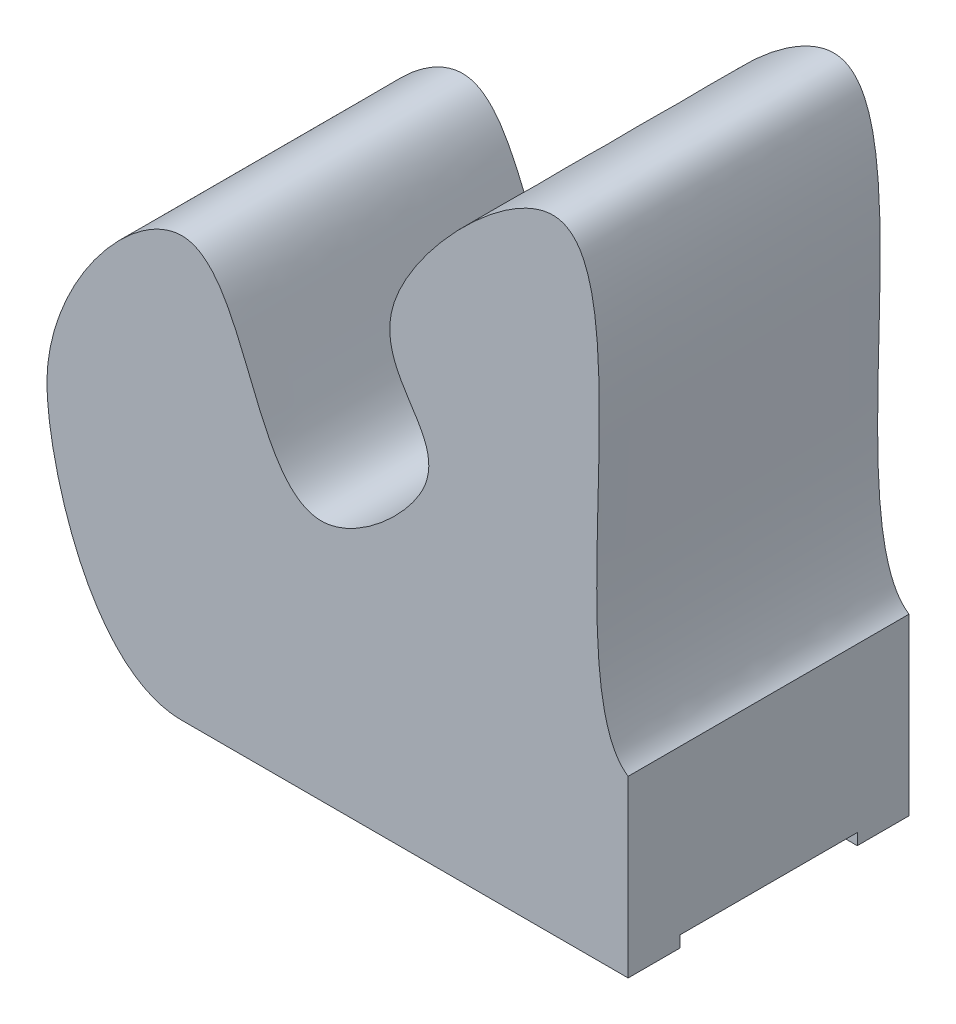
ISO-10303-21;
HEADER;
FILE_DESCRIPTION(('STEP AP214'),'2;1');
FILE_NAME('part.step','',(''),(''),'','','');
FILE_SCHEMA(('AUTOMOTIVE_DESIGN { 1 0 10303 214 1 1 1 1 }'));
ENDSEC;
DATA;
#1=APPLICATION_CONTEXT('core data for automotive mechanical design processes');
#2=APPLICATION_PROTOCOL_DEFINITION('international standard','automotive_design',2000,#1);
#3=PRODUCT_CONTEXT('',#1,'mechanical');
#4=PRODUCT('Part','Part','',(#3));
#5=PRODUCT_RELATED_PRODUCT_CATEGORY('part','',(#4));
#6=PRODUCT_DEFINITION_FORMATION('','',#4);
#7=PRODUCT_DEFINITION_CONTEXT('part definition',#1,'design');
#8=PRODUCT_DEFINITION('design','',#6,#7);
#9=PRODUCT_DEFINITION_SHAPE('','',#8);
#10=(LENGTH_UNIT() NAMED_UNIT(*) SI_UNIT(.MILLI.,.METRE.));
#11=(NAMED_UNIT(*) PLANE_ANGLE_UNIT() SI_UNIT($,.RADIAN.));
#12=(NAMED_UNIT(*) SI_UNIT($,.STERADIAN.) SOLID_ANGLE_UNIT());
#13=UNCERTAINTY_MEASURE_WITH_UNIT(LENGTH_MEASURE(1.E-05),#10,'distance_accuracy_value','');
#14=(GEOMETRIC_REPRESENTATION_CONTEXT(3) GLOBAL_UNCERTAINTY_ASSIGNED_CONTEXT((#13)) GLOBAL_UNIT_ASSIGNED_CONTEXT((#10,
#11,#12)) REPRESENTATION_CONTEXT('',''));
#15=CARTESIAN_POINT('',(0.,0.,0.));
#16=DIRECTION('',(0.,0.,1.));
#17=DIRECTION('',(1.,0.,0.));
#18=AXIS2_PLACEMENT_3D('',#15,#16,#17);
#19=CARTESIAN_POINT('',(0.,0.,5.9944));
#20=DIRECTION('',(0.,1.,0.));
#21=DIRECTION('',(0.,0.,1.));
#22=AXIS2_PLACEMENT_3D('',#19,#20,#21);
#23=PLANE('',#22);
#24=DIRECTION('',(-1.,0.,0.));
#25=VECTOR('',#24,1.);
#26=CARTESIAN_POINT('',(0.,0.,3.78540889222271));
#27=LINE('',#26,#25);
#28=CARTESIAN_POINT('',(19.05,0.,3.78540889222271));
#29=VERTEX_POINT('',#28);
#30=CARTESIAN_POINT('',(2.54,0.,3.78540889222271));
#31=VERTEX_POINT('',#30);
#32=EDGE_CURVE('E135',#29,#31,#27,.T.);
#33=ORIENTED_EDGE('',*,*,#32,.F.);
#34=DIRECTION('',(0.,0.,-1.));
#35=VECTOR('',#34,1.);
#36=CARTESIAN_POINT('',(19.05,0.,5.9944));
#37=LINE('',#36,#35);
#38=CARTESIAN_POINT('',(19.05,0.,5.9944));
#39=VERTEX_POINT('',#38);
#40=EDGE_CURVE('E126',#39,#29,#37,.T.);
#41=ORIENTED_EDGE('',*,*,#40,.F.);
#42=DIRECTION('',(1.,0.,0.));
#43=VECTOR('',#42,1.);
#44=CARTESIAN_POINT('',(0.,0.,5.9944));
#45=LINE('',#44,#43);
#46=CARTESIAN_POINT('',(0.,0.,5.9944));
#47=VERTEX_POINT('',#46);
#48=EDGE_CURVE('E144',#47,#39,#45,.T.);
#49=ORIENTED_EDGE('',*,*,#48,.F.);
#50=DIRECTION('',(0.,0.,-1.));
#51=VECTOR('',#50,1.);
#52=CARTESIAN_POINT('',(0.,0.,5.9944));
#53=LINE('',#52,#51);
#54=CARTESIAN_POINT('',(0.,0.,1.24540889222272));
#55=VERTEX_POINT('',#54);
#56=EDGE_CURVE('E194',#47,#55,#53,.T.);
#57=ORIENTED_EDGE('',*,*,#56,.T.);
#58=CARTESIAN_POINT('',(2.54,0.,1.24540889222271));
#59=DIRECTION('',(0.,1.,0.));
#60=DIRECTION('',(0.,0.,1.));
#61=AXIS2_PLACEMENT_3D('',#58,#59,#60);
#62=CIRCLE('',#61,2.54);
#63=EDGE_CURVE('E11',#55,#31,#62,.T.);
#64=ORIENTED_EDGE('',*,*,#63,.T.);
#65=EDGE_LOOP('',(#33,#41,#49,#57,#64));
#66=FACE_BOUND('',#65,.T.);
#67=ADVANCED_FACE('F35',(#66),#23,.F.);
#68=DIRECTION('',(1.,0.,0.));
#69=VECTOR('',#68,1.);
#70=CARTESIAN_POINT('',(0.,0.,-3.78540889222271));
#71=LINE('',#70,#69);
#72=CARTESIAN_POINT('',(2.54,0.,-3.78540889222271));
#73=VERTEX_POINT('',#72);
#74=CARTESIAN_POINT('',(19.05,0.,-3.78540889222271));
#75=VERTEX_POINT('',#74);
#76=EDGE_CURVE('E133',#73,#75,#71,.T.);
#77=ORIENTED_EDGE('',*,*,#76,.F.);
#78=CARTESIAN_POINT('',(2.54,0.,-1.24540889222271));
#79=DIRECTION('',(0.,1.,0.));
#80=DIRECTION('',(0.,0.,1.));
#81=AXIS2_PLACEMENT_3D('',#78,#79,#80);
#82=CIRCLE('',#81,2.54);
#83=CARTESIAN_POINT('',(0.,0.,-1.24540889222271));
#84=VERTEX_POINT('',#83);
#85=EDGE_CURVE('E44',#73,#84,#82,.T.);
#86=ORIENTED_EDGE('',*,*,#85,.T.);
#87=CARTESIAN_POINT('',(0.,0.,-5.9944));
#88=VERTEX_POINT('',#87);
#89=EDGE_CURVE('E51',#84,#88,#53,.T.);
#90=ORIENTED_EDGE('',*,*,#89,.T.);
#91=DIRECTION('',(1.,0.,0.));
#92=VECTOR('',#91,1.);
#93=CARTESIAN_POINT('',(0.,0.,-5.9944));
#94=LINE('',#93,#92);
#95=CARTESIAN_POINT('',(19.05,0.,-5.9944));
#96=VERTEX_POINT('',#95);
#97=EDGE_CURVE('E204',#88,#96,#94,.T.);
#98=ORIENTED_EDGE('',*,*,#97,.T.);
#99=EDGE_CURVE('E198',#75,#96,#37,.T.);
#100=ORIENTED_EDGE('',*,*,#99,.F.);
#101=EDGE_LOOP('',(#77,#86,#90,#98,#100));
#102=FACE_BOUND('',#101,.T.);
#103=ADVANCED_FACE('F168',(#102),#23,.F.);
#104=CARTESIAN_POINT('',(19.05,0.,5.9944));
#105=DIRECTION('',(-1.,0.,0.));
#106=DIRECTION('',(0.,0.,1.));
#107=AXIS2_PLACEMENT_3D('',#104,#105,#106);
#108=PLANE('',#107);
#109=DIRECTION('',(0.,-1.,0.));
#110=VECTOR('',#109,1.);
#111=CARTESIAN_POINT('',(19.05,-0.486987770816475,3.78540889222271));
#112=LINE('',#111,#110);
#113=CARTESIAN_POINT('',(19.05,0.486987770816475,3.78540889222271));
#114=VERTEX_POINT('',#113);
#115=EDGE_CURVE('E113',#114,#29,#112,.T.);
#116=ORIENTED_EDGE('',*,*,#115,.F.);
#117=DIRECTION('',(0.,0.,1.));
#118=VECTOR('',#117,1.);
#119=CARTESIAN_POINT('',(19.05,0.486987770816475,3.78540889222271));
#120=LINE('',#119,#118);
#121=CARTESIAN_POINT('',(19.05,0.486987770816475,-3.78540889222271));
#122=VERTEX_POINT('',#121);
#123=EDGE_CURVE('E101',#122,#114,#120,.T.);
#124=ORIENTED_EDGE('',*,*,#123,.F.);
#125=DIRECTION('',(0.,1.,0.));
#126=VECTOR('',#125,1.);
#127=CARTESIAN_POINT('',(19.05,0.,-3.78540889222271));
#128=LINE('',#127,#126);
#129=EDGE_CURVE('E192',#75,#122,#128,.T.);
#130=ORIENTED_EDGE('',*,*,#129,.F.);
#131=ORIENTED_EDGE('',*,*,#99,.T.);
#132=DIRECTION('',(0.,1.,0.));
#133=VECTOR('',#132,1.);
#134=CARTESIAN_POINT('',(19.05,0.,-5.9944));
#135=LINE('',#134,#133);
#136=CARTESIAN_POINT('',(19.05,7.45545239430195,-5.9944));
#137=VERTEX_POINT('',#136);
#138=EDGE_CURVE('E145',#96,#137,#135,.T.);
#139=ORIENTED_EDGE('',*,*,#138,.T.);
#140=DIRECTION('',(0.,0.,-1.));
#141=VECTOR('',#140,1.);
#142=CARTESIAN_POINT('',(19.05,7.45545239430195,5.9944));
#143=LINE('',#142,#141);
#144=CARTESIAN_POINT('',(19.05,7.45545239430195,5.9944));
#145=VERTEX_POINT('',#144);
#146=EDGE_CURVE('E199',#145,#137,#143,.T.);
#147=ORIENTED_EDGE('',*,*,#146,.F.);
#148=DIRECTION('',(0.,1.,0.));
#149=VECTOR('',#148,1.);
#150=CARTESIAN_POINT('',(19.05,0.,5.9944));
#151=LINE('',#150,#149);
#152=EDGE_CURVE('E202',#39,#145,#151,.T.);
#153=ORIENTED_EDGE('',*,*,#152,.F.);
#154=ORIENTED_EDGE('',*,*,#40,.T.);
#155=EDGE_LOOP('',(#116,#124,#130,#131,#139,#147,#153,#154));
#156=FACE_BOUND('',#155,.T.);
#157=ADVANCED_FACE('F123',(#156),#108,.F.);
#158=CARTESIAN_POINT('',(19.05,7.45545239430195,5.9944));
#159=CARTESIAN_POINT('',(15.8655740153402,9.53247798898436,5.9944));
#160=CARTESIAN_POINT('',(21.9219170806714,34.9860849461761,5.9944));
#161=CARTESIAN_POINT('',(5.26429966956822,17.7196998622476,5.9944));
#162=CARTESIAN_POINT('',(13.316526162953,15.6309434229593,5.9944));
#163=CARTESIAN_POINT('',(3.0702367233462,6.42900629588776,5.9944));
#164=CARTESIAN_POINT('',(2.72878714000501,23.0971659895803,5.9944));
#165=CARTESIAN_POINT('',(-5.48746922203041,13.8702237083751,5.9944));
#166=CARTESIAN_POINT('',(-5.9595542931162,7.46687969693,5.9944));
#167=CARTESIAN_POINT('',(-3.66286386698529,0.,5.9944));
#168=CARTESIAN_POINT('',(0.,0.,5.9944));
#169=B_SPLINE_CURVE_WITH_KNOTS('',3,(#158,#159,#160,#161,#162,#163,#164,#165,#166,#167,#168),
.UNSPECIFIED.,.F.,.F.,(4,1,1,1,1,1,1,1,4),(0.,0.255088260770588,0.380224882964674,
0.524451039259633,0.608261996068711,0.787372105814438,0.906220789152816,0.927483578571372,1.),.UNSPECIFIED.);
#170=DIRECTION('',(0.,0.,-1.));
#171=VECTOR('',#170,1.);
#172=SURFACE_OF_LINEAR_EXTRUSION('',#169,#171);
#173=CARTESIAN_POINT('',(19.05,7.45545239430195,-5.9944));
#174=CARTESIAN_POINT('',(15.8655740153402,9.53247798898436,-5.9944));
#175=CARTESIAN_POINT('',(21.9219170806714,34.9860849461761,-5.9944));
#176=CARTESIAN_POINT('',(5.26429966956822,17.7196998622476,-5.9944));
#177=CARTESIAN_POINT('',(13.316526162953,15.6309434229593,-5.9944));
#178=CARTESIAN_POINT('',(3.0702367233462,6.42900629588776,-5.9944));
#179=CARTESIAN_POINT('',(2.72878714000501,23.0971659895803,-5.9944));
#180=CARTESIAN_POINT('',(-5.48746922203041,13.8702237083751,-5.9944));
#181=CARTESIAN_POINT('',(-5.9595542931162,7.46687969693,-5.9944));
#182=CARTESIAN_POINT('',(-3.66286386698529,0.,-5.9944));
#183=CARTESIAN_POINT('',(0.,0.,-5.9944));
#184=B_SPLINE_CURVE_WITH_KNOTS('',3,(#173,#174,#175,#176,#177,#178,#179,#180,#181,#182,#183),
.UNSPECIFIED.,.F.,.F.,(4,1,1,1,1,1,1,1,4),(0.,0.255088260770588,0.380224882964674,
0.524451039259633,0.608261996068711,0.787372105814438,0.906220789152816,0.927483578571372,1.),.UNSPECIFIED.);
#185=EDGE_CURVE('E137',#137,#88,#184,.T.);
#186=ORIENTED_EDGE('',*,*,#185,.T.);
#187=ORIENTED_EDGE('',*,*,#89,.F.);
#188=EDGE_CURVE('E196',#55,#84,#53,.T.);
#189=ORIENTED_EDGE('',*,*,#188,.F.);
#190=ORIENTED_EDGE('',*,*,#56,.F.);
#191=EDGE_CURVE('E138',#145,#47,#169,.T.);
#192=ORIENTED_EDGE('',*,*,#191,.F.);
#193=ORIENTED_EDGE('',*,*,#146,.T.);
#194=EDGE_LOOP('',(#186,#187,#189,#190,#192,#193));
#195=FACE_BOUND('',#194,.T.);
#196=ADVANCED_FACE('F151',(#195),#172,.F.);
#197=CARTESIAN_POINT('',(10.5360785254702,14.8458133384204,5.9944));
#198=DIRECTION('',(0.,0.,1.));
#199=DIRECTION('',(1.,0.,0.));
#200=AXIS2_PLACEMENT_3D('',#197,#198,#199);
#201=PLANE('',#200);
#202=ORIENTED_EDGE('',*,*,#191,.T.);
#203=ORIENTED_EDGE('',*,*,#48,.T.);
#204=ORIENTED_EDGE('',*,*,#152,.T.);
#205=EDGE_LOOP('',(#202,#203,#204));
#206=FACE_BOUND('',#205,.T.);
#207=ADVANCED_FACE('F154',(#206),#201,.T.);
#208=CARTESIAN_POINT('',(10.5360785254702,14.8458133384204,-5.9944));
#209=DIRECTION('',(0.,0.,1.));
#210=DIRECTION('',(1.,0.,0.));
#211=AXIS2_PLACEMENT_3D('',#208,#209,#210);
#212=PLANE('',#211);
#213=ORIENTED_EDGE('',*,*,#185,.F.);
#214=ORIENTED_EDGE('',*,*,#138,.F.);
#215=ORIENTED_EDGE('',*,*,#97,.F.);
#216=EDGE_LOOP('',(#213,#214,#215));
#217=FACE_BOUND('',#216,.T.);
#218=ADVANCED_FACE('F227',(#217),#212,.F.);
#219=CARTESIAN_POINT('',(0.,0.,0.));
#220=DIRECTION('',(-1.,0.,0.));
#221=DIRECTION('',(0.,0.,1.));
#222=AXIS2_PLACEMENT_3D('',#219,#220,#221);
#223=PLANE('',#222);
#224=ORIENTED_EDGE('',*,*,#188,.T.);
#225=DIRECTION('',(0.,1.,0.));
#226=VECTOR('',#225,1.);
#227=CARTESIAN_POINT('',(0.,0.,-1.24540889222271));
#228=LINE('',#227,#226);
#229=CARTESIAN_POINT('',(0.,0.486987770816475,-1.24540889222271));
#230=VERTEX_POINT('',#229);
#231=EDGE_CURVE('E187',#84,#230,#228,.T.);
#232=ORIENTED_EDGE('',*,*,#231,.T.);
#233=DIRECTION('',(0.,0.,1.));
#234=VECTOR('',#233,1.);
#235=CARTESIAN_POINT('',(0.,0.486987770816475,3.78540889222271));
#236=LINE('',#235,#234);
#237=CARTESIAN_POINT('',(0.,0.486987770816475,1.24540889222271));
#238=VERTEX_POINT('',#237);
#239=EDGE_CURVE('E127',#230,#238,#236,.T.);
#240=ORIENTED_EDGE('',*,*,#239,.T.);
#241=DIRECTION('',(0.,-1.,0.));
#242=VECTOR('',#241,1.);
#243=CARTESIAN_POINT('',(0.,0.,1.24540889222271));
#244=LINE('',#243,#242);
#245=EDGE_CURVE('E190',#238,#55,#244,.T.);
#246=ORIENTED_EDGE('',*,*,#245,.T.);
#247=EDGE_LOOP('',(#224,#232,#240,#246));
#248=FACE_BOUND('',#247,.T.);
#249=ADVANCED_FACE('F230',(#248),#223,.F.);
#250=CARTESIAN_POINT('',(19.05,-0.486987770816475,3.78540889222271));
#251=DIRECTION('',(0.,0.,-1.));
#252=DIRECTION('',(-1.,0.,0.));
#253=AXIS2_PLACEMENT_3D('',#250,#251,#252);
#254=PLANE('',#253);
#255=ORIENTED_EDGE('',*,*,#32,.T.);
#256=DIRECTION('',(0.,-1.,0.));
#257=VECTOR('',#256,1.);
#258=CARTESIAN_POINT('',(2.54,-0.486987770816475,3.78540889222271));
#259=LINE('',#258,#257);
#260=CARTESIAN_POINT('',(2.54000000000001,0.486987770816475,3.78540889222271));
#261=VERTEX_POINT('',#260);
#262=EDGE_CURVE('E120',#31,#261,#259,.F.);
#263=ORIENTED_EDGE('',*,*,#262,.T.);
#264=DIRECTION('',(-1.,0.,0.));
#265=VECTOR('',#264,1.);
#266=CARTESIAN_POINT('',(19.05,0.486987770816475,3.78540889222271));
#267=LINE('',#266,#265);
#268=EDGE_CURVE('E105',#114,#261,#267,.T.);
#269=ORIENTED_EDGE('',*,*,#268,.F.);
#270=ORIENTED_EDGE('',*,*,#115,.T.);
#271=EDGE_LOOP('',(#255,#263,#269,#270));
#272=FACE_BOUND('',#271,.T.);
#273=ADVANCED_FACE('F117',(#272),#254,.T.);
#274=CARTESIAN_POINT('',(19.05,-0.486987770816475,-3.78540889222271));
#275=DIRECTION('',(0.,0.,1.));
#276=DIRECTION('',(1.,0.,0.));
#277=AXIS2_PLACEMENT_3D('',#274,#275,#276);
#278=PLANE('',#277);
#279=DIRECTION('',(-1.,0.,0.));
#280=VECTOR('',#279,1.);
#281=CARTESIAN_POINT('',(19.05,0.486987770816475,-3.78540889222271));
#282=LINE('',#281,#280);
#283=CARTESIAN_POINT('',(2.54000000000001,0.486987770816475,-3.78540889222271));
#284=VERTEX_POINT('',#283);
#285=EDGE_CURVE('E108',#122,#284,#282,.T.);
#286=ORIENTED_EDGE('',*,*,#285,.T.);
#287=DIRECTION('',(0.,1.,0.));
#288=VECTOR('',#287,1.);
#289=CARTESIAN_POINT('',(2.54,-0.486987770816475,-3.78540889222271));
#290=LINE('',#289,#288);
#291=EDGE_CURVE('E179',#284,#73,#290,.F.);
#292=ORIENTED_EDGE('',*,*,#291,.T.);
#293=ORIENTED_EDGE('',*,*,#76,.T.);
#294=ORIENTED_EDGE('',*,*,#129,.T.);
#295=EDGE_LOOP('',(#286,#292,#293,#294));
#296=FACE_BOUND('',#295,.T.);
#297=ADVANCED_FACE('F164',(#296),#278,.T.);
#298=CARTESIAN_POINT('',(19.05,0.486987770816475,3.78540889222271));
#299=DIRECTION('',(0.,-1.,0.));
#300=DIRECTION('',(0.,0.,-1.));
#301=AXIS2_PLACEMENT_3D('',#298,#299,#300);
#302=PLANE('',#301);
#303=ORIENTED_EDGE('',*,*,#239,.F.);
#304=CARTESIAN_POINT('',(2.54,0.486987770816475,-1.24540889222271));
#305=DIRECTION('',(0.,-1.,0.));
#306=DIRECTION('',(0.,0.,-1.));
#307=AXIS2_PLACEMENT_3D('',#304,#305,#306);
#308=CIRCLE('',#307,2.54);
#309=EDGE_CURVE('E182',#230,#284,#308,.T.);
#310=ORIENTED_EDGE('',*,*,#309,.T.);
#311=ORIENTED_EDGE('',*,*,#285,.F.);
#312=ORIENTED_EDGE('',*,*,#123,.T.);
#313=ORIENTED_EDGE('',*,*,#268,.T.);
#314=CARTESIAN_POINT('',(2.54,0.486987770816475,1.24540889222271));
#315=DIRECTION('',(0.,-1.,0.));
#316=DIRECTION('',(0.,0.,-1.));
#317=AXIS2_PLACEMENT_3D('',#314,#315,#316);
#318=CIRCLE('',#317,2.54);
#319=EDGE_CURVE('E178',#261,#238,#318,.T.);
#320=ORIENTED_EDGE('',*,*,#319,.T.);
#321=EDGE_LOOP('',(#303,#310,#311,#312,#313,#320));
#322=FACE_BOUND('',#321,.T.);
#323=ADVANCED_FACE('F104',(#322),#302,.T.);
#324=CARTESIAN_POINT('',(2.54,0.,-1.24540889222271));
#325=DIRECTION('',(0.,1.,0.));
#326=DIRECTION('',(0.,0.,1.));
#327=AXIS2_PLACEMENT_3D('',#324,#325,#326);
#328=CYLINDRICAL_SURFACE('',#327,2.54);
#329=ORIENTED_EDGE('',*,*,#85,.F.);
#330=ORIENTED_EDGE('',*,*,#291,.F.);
#331=ORIENTED_EDGE('',*,*,#309,.F.);
#332=ORIENTED_EDGE('',*,*,#231,.F.);
#333=EDGE_LOOP('',(#329,#330,#331,#332));
#334=FACE_BOUND('',#333,.T.);
#335=ADVANCED_FACE('F156',(#334),#328,.F.);
#336=CARTESIAN_POINT('',(2.54,0.,1.24540889222271));
#337=DIRECTION('',(0.,-1.,0.));
#338=DIRECTION('',(0.,0.,-1.));
#339=AXIS2_PLACEMENT_3D('',#336,#337,#338);
#340=CYLINDRICAL_SURFACE('',#339,2.54);
#341=ORIENTED_EDGE('',*,*,#319,.F.);
#342=ORIENTED_EDGE('',*,*,#262,.F.);
#343=ORIENTED_EDGE('',*,*,#63,.F.);
#344=ORIENTED_EDGE('',*,*,#245,.F.);
#345=EDGE_LOOP('',(#341,#342,#343,#344));
#346=FACE_BOUND('',#345,.T.);
#347=ADVANCED_FACE('F37',(#346),#340,.F.);
#348=CLOSED_SHELL('',(#67,#103,#157,#196,#207,#218,#249,#273,#297,#323,#335,#347));
#349=MANIFOLD_SOLID_BREP('B2',#348);
#350=ADVANCED_BREP_SHAPE_REPRESENTATION('',(#18,#349),#14);
#351=SHAPE_DEFINITION_REPRESENTATION(#9,#350);
ENDSEC;
END-ISO-10303-21;
